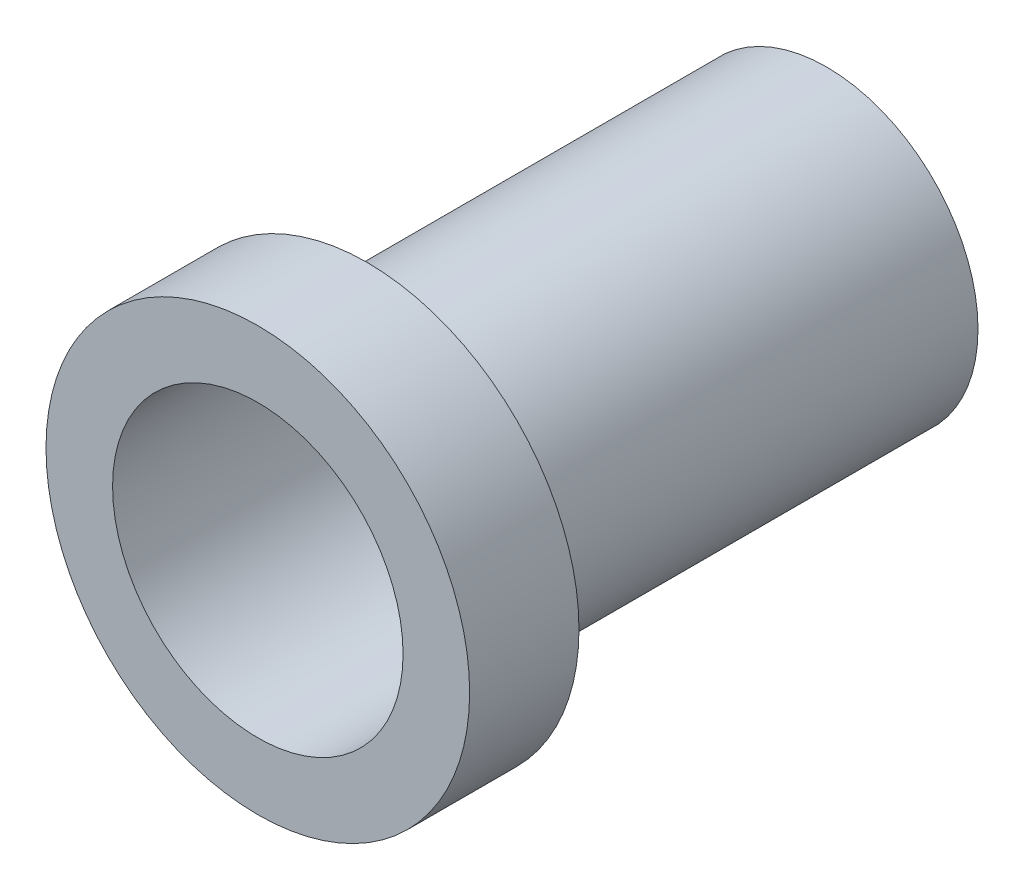
ISO-10303-21;
HEADER;
FILE_DESCRIPTION(('STEP AP214'),'2;1');
FILE_NAME('part.step','',(''),(''),'','','');
FILE_SCHEMA(('AUTOMOTIVE_DESIGN { 1 0 10303 214 1 1 1 1 }'));
ENDSEC;
DATA;
#1=APPLICATION_CONTEXT('core data for automotive mechanical design processes');
#2=APPLICATION_PROTOCOL_DEFINITION('international standard','automotive_design',2000,#1);
#3=PRODUCT_CONTEXT('',#1,'mechanical');
#4=PRODUCT('Part','Part','',(#3));
#5=PRODUCT_RELATED_PRODUCT_CATEGORY('part','',(#4));
#6=PRODUCT_DEFINITION_FORMATION('','',#4);
#7=PRODUCT_DEFINITION_CONTEXT('part definition',#1,'design');
#8=PRODUCT_DEFINITION('design','',#6,#7);
#9=PRODUCT_DEFINITION_SHAPE('','',#8);
#10=(LENGTH_UNIT() NAMED_UNIT(*) SI_UNIT(.MILLI.,.METRE.));
#11=(NAMED_UNIT(*) PLANE_ANGLE_UNIT() SI_UNIT($,.RADIAN.));
#12=(NAMED_UNIT(*) SI_UNIT($,.STERADIAN.) SOLID_ANGLE_UNIT());
#13=UNCERTAINTY_MEASURE_WITH_UNIT(LENGTH_MEASURE(1.E-05),#10,'distance_accuracy_value','');
#14=(GEOMETRIC_REPRESENTATION_CONTEXT(3) GLOBAL_UNCERTAINTY_ASSIGNED_CONTEXT((#13)) GLOBAL_UNIT_ASSIGNED_CONTEXT((#10,
#11,#12)) REPRESENTATION_CONTEXT('',''));
#15=CARTESIAN_POINT('',(0.,0.,0.));
#16=DIRECTION('',(0.,0.,1.));
#17=DIRECTION('',(1.,0.,0.));
#18=AXIS2_PLACEMENT_3D('',#15,#16,#17);
#19=CARTESIAN_POINT('',(0.,0.,40.));
#20=DIRECTION('',(0.,0.,-1.));
#21=DIRECTION('',(-1.,0.,0.));
#22=AXIS2_PLACEMENT_3D('',#19,#20,#21);
#23=CYLINDRICAL_SURFACE('',#22,12.5);
#24=CARTESIAN_POINT('',(0.,0.,37.9657813872209));
#25=DIRECTION('',(0.,0.,-1.));
#26=DIRECTION('',(-1.,0.,0.));
#27=AXIS2_PLACEMENT_3D('',#24,#25,#26);
#28=CIRCLE('',#27,12.5);
#29=CARTESIAN_POINT('',(-12.5,0.,37.9657813872209));
#30=VERTEX_POINT('',#29);
#31=EDGE_CURVE('E59',#30,#30,#28,.T.);
#32=ORIENTED_EDGE('',*,*,#31,.T.);
#33=EDGE_LOOP('',(#32));
#34=FACE_BOUND('',#33,.T.);
#35=CARTESIAN_POINT('',(0.,0.,0.));
#36=DIRECTION('',(0.,0.,1.));
#37=DIRECTION('',(1.,0.,0.));
#38=AXIS2_PLACEMENT_3D('',#35,#36,#37);
#39=CIRCLE('',#38,12.5);
#40=CARTESIAN_POINT('',(12.5,0.,0.));
#41=VERTEX_POINT('',#40);
#42=EDGE_CURVE('E10',#41,#41,#39,.T.);
#43=ORIENTED_EDGE('',*,*,#42,.T.);
#44=EDGE_LOOP('',(#43));
#45=FACE_BOUND('',#44,.T.);
#46=ADVANCED_FACE('F36',(#34,#45),#23,.T.);
#47=CARTESIAN_POINT('',(0.,0.,0.));
#48=DIRECTION('',(0.,0.,1.));
#49=DIRECTION('',(1.,0.,0.));
#50=AXIS2_PLACEMENT_3D('',#47,#48,#49);
#51=PLANE('',#50);
#52=ORIENTED_EDGE('',*,*,#42,.F.);
#53=EDGE_LOOP('',(#52));
#54=FACE_BOUND('',#53,.T.);
#55=CARTESIAN_POINT('',(0.,0.,0.));
#56=DIRECTION('',(0.,0.,1.));
#57=DIRECTION('',(1.,0.,0.));
#58=AXIS2_PLACEMENT_3D('',#55,#56,#57);
#59=CIRCLE('',#58,12.);
#60=CARTESIAN_POINT('',(12.,0.,0.));
#61=VERTEX_POINT('',#60);
#62=EDGE_CURVE('E43',#61,#61,#59,.T.);
#63=ORIENTED_EDGE('',*,*,#62,.T.);
#64=EDGE_LOOP('',(#63));
#65=FACE_BOUND('',#64,.T.);
#66=ADVANCED_FACE('F84',(#54,#65),#51,.F.);
#67=CARTESIAN_POINT('',(0.,0.,40.));
#68=DIRECTION('',(0.,0.,-1.));
#69=DIRECTION('',(-1.,0.,0.));
#70=AXIS2_PLACEMENT_3D('',#67,#68,#69);
#71=CYLINDRICAL_SURFACE('',#70,12.);
#72=ORIENTED_EDGE('',*,*,#62,.F.);
#73=EDGE_LOOP('',(#72));
#74=FACE_BOUND('',#73,.T.);
#75=CARTESIAN_POINT('',(0.,0.,47.));
#76=DIRECTION('',(0.,0.,1.));
#77=DIRECTION('',(1.,0.,0.));
#78=AXIS2_PLACEMENT_3D('',#75,#76,#77);
#79=CIRCLE('',#78,12.);
#80=CARTESIAN_POINT('',(12.,0.,47.));
#81=VERTEX_POINT('',#80);
#82=EDGE_CURVE('E53',#81,#81,#79,.T.);
#83=ORIENTED_EDGE('',*,*,#82,.T.);
#84=EDGE_LOOP('',(#83));
#85=FACE_BOUND('',#84,.T.);
#86=ADVANCED_FACE('F89',(#74,#85),#71,.F.);
#87=CARTESIAN_POINT('',(0.,0.,37.9657813872209));
#88=DIRECTION('',(0.,0.,-1.));
#89=DIRECTION('',(-1.,0.,0.));
#90=AXIS2_PLACEMENT_3D('',#87,#88,#89);
#91=PLANE('',#90);
#92=ORIENTED_EDGE('',*,*,#31,.F.);
#93=EDGE_LOOP('',(#92));
#94=FACE_BOUND('',#93,.T.);
#95=CARTESIAN_POINT('',(0.,0.,37.9657813872209));
#96=DIRECTION('',(0.,0.,-1.));
#97=DIRECTION('',(-1.,0.,0.));
#98=AXIS2_PLACEMENT_3D('',#95,#96,#97);
#99=CIRCLE('',#98,17.5);
#100=CARTESIAN_POINT('',(-17.5,0.,37.9657813872209));
#101=VERTEX_POINT('',#100);
#102=EDGE_CURVE('E63',#101,#101,#99,.T.);
#103=ORIENTED_EDGE('',*,*,#102,.T.);
#104=EDGE_LOOP('',(#103));
#105=FACE_BOUND('',#104,.T.);
#106=ADVANCED_FACE('F68',(#94,#105),#91,.T.);
#107=CARTESIAN_POINT('',(0.,0.,47.));
#108=DIRECTION('',(0.,0.,1.));
#109=DIRECTION('',(1.,0.,0.));
#110=AXIS2_PLACEMENT_3D('',#107,#108,#109);
#111=PLANE('',#110);
#112=CARTESIAN_POINT('',(0.,0.,47.));
#113=DIRECTION('',(0.,0.,1.));
#114=DIRECTION('',(1.,0.,0.));
#115=AXIS2_PLACEMENT_3D('',#112,#113,#114);
#116=CIRCLE('',#115,17.5);
#117=CARTESIAN_POINT('',(17.5,0.,47.));
#118=VERTEX_POINT('',#117);
#119=EDGE_CURVE('E48',#118,#118,#116,.T.);
#120=ORIENTED_EDGE('',*,*,#119,.T.);
#121=EDGE_LOOP('',(#120));
#122=FACE_BOUND('',#121,.T.);
#123=ORIENTED_EDGE('',*,*,#82,.F.);
#124=EDGE_LOOP('',(#123));
#125=FACE_BOUND('',#124,.T.);
#126=ADVANCED_FACE('F72',(#122,#125),#111,.T.);
#127=CARTESIAN_POINT('',(0.,0.,38.9657813872209));
#128=DIRECTION('',(0.,0.,1.));
#129=DIRECTION('',(1.,0.,0.));
#130=AXIS2_PLACEMENT_3D('',#127,#128,#129);
#131=CYLINDRICAL_SURFACE('',#130,17.5);
#132=ORIENTED_EDGE('',*,*,#119,.F.);
#133=EDGE_LOOP('',(#132));
#134=FACE_BOUND('',#133,.T.);
#135=ORIENTED_EDGE('',*,*,#102,.F.);
#136=EDGE_LOOP('',(#135));
#137=FACE_BOUND('',#136,.T.);
#138=ADVANCED_FACE('F70',(#134,#137),#131,.T.);
#139=CLOSED_SHELL('',(#46,#66,#86,#106,#126,#138));
#140=MANIFOLD_SOLID_BREP('B2',#139);
#141=ADVANCED_BREP_SHAPE_REPRESENTATION('',(#18,#140),#14);
#142=SHAPE_DEFINITION_REPRESENTATION(#9,#141);
ENDSEC;
END-ISO-10303-21;
